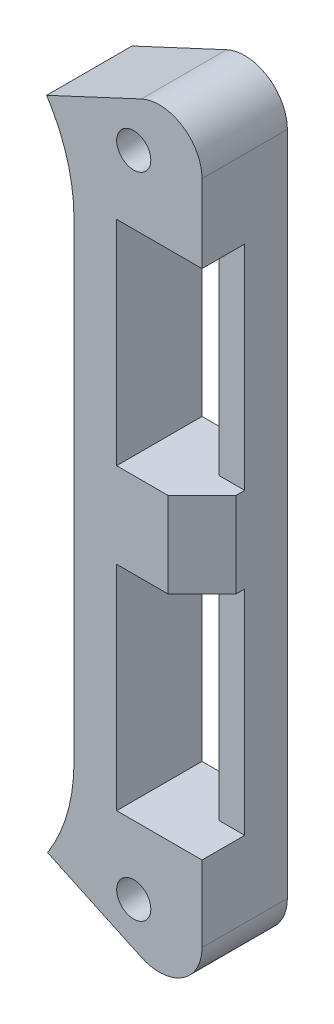
ISO-10303-21;
HEADER;
FILE_DESCRIPTION(('STEP AP214'),'2;1');
FILE_NAME('part.step','',(''),(''),'','','');
FILE_SCHEMA(('AUTOMOTIVE_DESIGN { 1 0 10303 214 1 1 1 1 }'));
ENDSEC;
DATA;
#1=APPLICATION_CONTEXT('core data for automotive mechanical design processes');
#2=APPLICATION_PROTOCOL_DEFINITION('international standard','automotive_design',2000,#1);
#3=PRODUCT_CONTEXT('',#1,'mechanical');
#4=PRODUCT('Part','Part','',(#3));
#5=PRODUCT_RELATED_PRODUCT_CATEGORY('part','',(#4));
#6=PRODUCT_DEFINITION_FORMATION('','',#4);
#7=PRODUCT_DEFINITION_CONTEXT('part definition',#1,'design');
#8=PRODUCT_DEFINITION('design','',#6,#7);
#9=PRODUCT_DEFINITION_SHAPE('','',#8);
#10=(LENGTH_UNIT() NAMED_UNIT(*) SI_UNIT(.MILLI.,.METRE.));
#11=(NAMED_UNIT(*) PLANE_ANGLE_UNIT() SI_UNIT($,.RADIAN.));
#12=(NAMED_UNIT(*) SI_UNIT($,.STERADIAN.) SOLID_ANGLE_UNIT());
#13=UNCERTAINTY_MEASURE_WITH_UNIT(LENGTH_MEASURE(1.E-05),#10,'distance_accuracy_value','');
#14=(GEOMETRIC_REPRESENTATION_CONTEXT(3) GLOBAL_UNCERTAINTY_ASSIGNED_CONTEXT((#13)) GLOBAL_UNIT_ASSIGNED_CONTEXT((#10,
#11,#12)) REPRESENTATION_CONTEXT('',''));
#15=CARTESIAN_POINT('',(0.,0.,0.));
#16=DIRECTION('',(0.,0.,1.));
#17=DIRECTION('',(1.,0.,0.));
#18=AXIS2_PLACEMENT_3D('',#15,#16,#17);
#19=CARTESIAN_POINT('',(-10.,76.7389258347136,-4.99999999999999));
#20=DIRECTION('',(0.,0.,-1.));
#21=DIRECTION('',(1.,0.,0.));
#22=AXIS2_PLACEMENT_3D('',#19,#20,#21);
#23=PLANE('',#22);
#24=DIRECTION('',(0.,-1.,0.));
#25=VECTOR('',#24,1.);
#26=CARTESIAN_POINT('',(0.,76.7389258347136,-4.99999999999999));
#27=LINE('',#26,#25);
#28=CARTESIAN_POINT('',(0.,76.7389258347136,-4.99999999999999));
#29=VERTEX_POINT('',#28);
#30=CARTESIAN_POINT('',(0.,51.7389258347136,-4.99999999999999));
#31=VERTEX_POINT('',#30);
#32=EDGE_CURVE('E230',#29,#31,#27,.T.);
#33=ORIENTED_EDGE('',*,*,#32,.F.);
#34=DIRECTION('',(1.,0.,0.));
#35=VECTOR('',#34,1.);
#36=CARTESIAN_POINT('',(-10.,76.7389258347136,-4.99999999999999));
#37=LINE('',#36,#35);
#38=CARTESIAN_POINT('',(-3.,76.7389258347136,-4.99999999999999));
#39=VERTEX_POINT('',#38);
#40=EDGE_CURVE('E238',#39,#29,#37,.T.);
#41=ORIENTED_EDGE('',*,*,#40,.F.);
#42=DIRECTION('',(0.,1.,0.));
#43=VECTOR('',#42,1.);
#44=CARTESIAN_POINT('',(-3.,76.7389258347136,-4.99999999999999));
#45=LINE('',#44,#43);
#46=CARTESIAN_POINT('',(-3.,51.7389258347136,-4.99999999999999));
#47=VERTEX_POINT('',#46);
#48=EDGE_CURVE('E316',#47,#39,#45,.T.);
#49=ORIENTED_EDGE('',*,*,#48,.F.);
#50=DIRECTION('',(-1.,0.,0.));
#51=VECTOR('',#50,1.);
#52=CARTESIAN_POINT('',(-10.,51.7389258347136,-4.99999999999999));
#53=LINE('',#52,#51);
#54=EDGE_CURVE('E362',#31,#47,#53,.T.);
#55=ORIENTED_EDGE('',*,*,#54,.F.);
#56=EDGE_LOOP('',(#33,#41,#49,#55));
#57=FACE_BOUND('',#56,.T.);
#58=ADVANCED_FACE('F35',(#57),#23,.F.);
#59=CARTESIAN_POINT('',(-10.,0.,0.));
#60=DIRECTION('',(-1.,0.,0.));
#61=DIRECTION('',(0.,0.,-1.));
#62=AXIS2_PLACEMENT_3D('',#59,#60,#61);
#63=PLANE('',#62);
#64=DIRECTION('',(0.,-1.,0.));
#65=VECTOR('',#64,1.);
#66=CARTESIAN_POINT('',(-10.,74.3641428895241,-10.));
#67=LINE('',#66,#65);
#68=CARTESIAN_POINT('',(-10.,76.7389258347136,-10.));
#69=VERTEX_POINT('',#68);
#70=CARTESIAN_POINT('',(-10.,51.7389258347136,-10.));
#71=VERTEX_POINT('',#70);
#72=EDGE_CURVE('E222',#69,#71,#67,.T.);
#73=ORIENTED_EDGE('',*,*,#72,.F.);
#74=DIRECTION('',(0.,0.,-1.));
#75=VECTOR('',#74,1.);
#76=CARTESIAN_POINT('',(-10.,76.7389258347136,0.));
#77=LINE('',#76,#75);
#78=CARTESIAN_POINT('',(-10.,76.7389258347136,0.));
#79=VERTEX_POINT('',#78);
#80=EDGE_CURVE('E213',#79,#69,#77,.T.);
#81=ORIENTED_EDGE('',*,*,#80,.F.);
#82=DIRECTION('',(0.,1.,0.));
#83=VECTOR('',#82,1.);
#84=CARTESIAN_POINT('',(-10.,76.7389258347136,0.));
#85=LINE('',#84,#83);
#86=CARTESIAN_POINT('',(-10.,51.7389258347136,0.));
#87=VERTEX_POINT('',#86);
#88=EDGE_CURVE('E214',#87,#79,#85,.T.);
#89=ORIENTED_EDGE('',*,*,#88,.F.);
#90=DIRECTION('',(0.,0.,1.));
#91=VECTOR('',#90,1.);
#92=CARTESIAN_POINT('',(-10.,51.7389258347136,0.));
#93=LINE('',#92,#91);
#94=EDGE_CURVE('E347',#71,#87,#93,.T.);
#95=ORIENTED_EDGE('',*,*,#94,.F.);
#96=EDGE_LOOP('',(#73,#81,#89,#95));
#97=FACE_BOUND('',#96,.T.);
#98=ADVANCED_FACE('F396',(#97),#63,.F.);
#99=CARTESIAN_POINT('',(-5.,76.7389258347136,-15.));
#100=DIRECTION('',(1.,0.,0.));
#101=DIRECTION('',(0.,0.,1.));
#102=AXIS2_PLACEMENT_3D('',#99,#100,#101);
#103=PLANE('',#102);
#104=DIRECTION('',(0.,-1.,0.));
#105=VECTOR('',#104,1.);
#106=CARTESIAN_POINT('',(-5.,76.7389258347136,-6.99999999999999));
#107=LINE('',#106,#105);
#108=CARTESIAN_POINT('',(-5.,76.7389258347136,-6.99999999999999));
#109=VERTEX_POINT('',#108);
#110=CARTESIAN_POINT('',(-5.,51.7389258347136,-6.99999999999999));
#111=VERTEX_POINT('',#110);
#112=EDGE_CURVE('E313',#109,#111,#107,.T.);
#113=ORIENTED_EDGE('',*,*,#112,.F.);
#114=DIRECTION('',(0.,0.,1.));
#115=VECTOR('',#114,1.);
#116=CARTESIAN_POINT('',(-5.,76.7389258347136,-15.));
#117=LINE('',#116,#115);
#118=CARTESIAN_POINT('',(-5.,76.7389258347136,-10.));
#119=VERTEX_POINT('',#118);
#120=EDGE_CURVE('E329',#119,#109,#117,.T.);
#121=ORIENTED_EDGE('',*,*,#120,.F.);
#122=DIRECTION('',(0.,1.,0.));
#123=VECTOR('',#122,1.);
#124=CARTESIAN_POINT('',(-5.,74.3641428895241,-10.));
#125=LINE('',#124,#123);
#126=CARTESIAN_POINT('',(-5.,51.7389258347136,-10.));
#127=VERTEX_POINT('',#126);
#128=EDGE_CURVE('E382',#127,#119,#125,.T.);
#129=ORIENTED_EDGE('',*,*,#128,.F.);
#130=DIRECTION('',(0.,0.,-1.));
#131=VECTOR('',#130,1.);
#132=CARTESIAN_POINT('',(-5.,51.7389258347136,-15.));
#133=LINE('',#132,#131);
#134=EDGE_CURVE('E198',#111,#127,#133,.T.);
#135=ORIENTED_EDGE('',*,*,#134,.F.);
#136=EDGE_LOOP('',(#113,#121,#129,#135));
#137=FACE_BOUND('',#136,.T.);
#138=ADVANCED_FACE('F466',(#137),#103,.F.);
#139=CARTESIAN_POINT('',(-5.,76.7389258347136,-6.99999999999999));
#140=DIRECTION('',(0.707106781186547,0.,-0.707106781186547));
#141=DIRECTION('',(0.,-1.,0.));
#142=AXIS2_PLACEMENT_3D('',#139,#140,#141);
#143=PLANE('',#142);
#144=DIRECTION('',(-0.707106781186548,0.,-0.707106781186548));
#145=VECTOR('',#144,1.);
#146=CARTESIAN_POINT('',(-5.,51.7389258347136,-6.99999999999999));
#147=LINE('',#146,#145);
#148=EDGE_CURVE('E337',#111,#47,#147,.F.);
#149=ORIENTED_EDGE('',*,*,#148,.T.);
#150=ORIENTED_EDGE('',*,*,#48,.T.);
#151=DIRECTION('',(0.707106781186548,0.,0.707106781186548));
#152=VECTOR('',#151,1.);
#153=CARTESIAN_POINT('',(-4.,76.7389258347136,-5.99999999999999));
#154=LINE('',#153,#152);
#155=EDGE_CURVE('E323',#39,#109,#154,.F.);
#156=ORIENTED_EDGE('',*,*,#155,.T.);
#157=ORIENTED_EDGE('',*,*,#112,.T.);
#158=EDGE_LOOP('',(#149,#150,#156,#157));
#159=FACE_BOUND('',#158,.T.);
#160=ADVANCED_FACE('F461',(#159),#143,.F.);
#161=CARTESIAN_POINT('',(-8.00000000000024,8.73892583471362,-10.));
#162=DIRECTION('',(0.,0.,1.));
#163=DIRECTION('',(-1.,0.,0.));
#164=AXIS2_PLACEMENT_3D('',#161,#162,#163);
#165=CYLINDRICAL_SURFACE('',#164,2.);
#166=CARTESIAN_POINT('',(-8.00000000000024,8.73892583471362,0.));
#167=DIRECTION('',(0.,0.,1.));
#168=DIRECTION('',(1.,0.,0.));
#169=AXIS2_PLACEMENT_3D('',#166,#167,#168);
#170=CIRCLE('',#169,2.);
#171=CARTESIAN_POINT('',(-6.00000000000024,8.73892583471362,0.));
#172=VERTEX_POINT('',#171);
#173=EDGE_CURVE('E245',#172,#172,#170,.T.);
#174=ORIENTED_EDGE('',*,*,#173,.T.);
#175=EDGE_LOOP('',(#174));
#176=FACE_BOUND('',#175,.T.);
#177=CARTESIAN_POINT('',(-8.00000000000024,8.73892583471362,-6.));
#178=DIRECTION('',(0.,0.,1.));
#179=DIRECTION('',(1.,0.,0.));
#180=AXIS2_PLACEMENT_3D('',#177,#178,#179);
#181=CIRCLE('',#180,2.);
#182=CARTESIAN_POINT('',(-6.00000000000024,8.73892583471362,-6.));
#183=VERTEX_POINT('',#182);
#184=EDGE_CURVE('E331',#183,#183,#181,.T.);
#185=ORIENTED_EDGE('',*,*,#184,.F.);
#186=EDGE_LOOP('',(#185));
#187=FACE_BOUND('',#186,.T.);
#188=ADVANCED_FACE('F474',(#176,#187),#165,.F.);
#189=CARTESIAN_POINT('',(-8.00000000000021,84.7389258347136,-10.));
#190=DIRECTION('',(0.,0.,1.));
#191=DIRECTION('',(-1.,0.,0.));
#192=AXIS2_PLACEMENT_3D('',#189,#190,#191);
#193=CYLINDRICAL_SURFACE('',#192,2.);
#194=CARTESIAN_POINT('',(-8.00000000000021,84.7389258347136,0.));
#195=DIRECTION('',(0.,0.,1.));
#196=DIRECTION('',(1.,0.,0.));
#197=AXIS2_PLACEMENT_3D('',#194,#195,#196);
#198=CIRCLE('',#197,2.);
#199=CARTESIAN_POINT('',(-6.00000000000021,84.7389258347136,0.));
#200=VERTEX_POINT('',#199);
#201=EDGE_CURVE('E235',#200,#200,#198,.T.);
#202=ORIENTED_EDGE('',*,*,#201,.T.);
#203=EDGE_LOOP('',(#202));
#204=FACE_BOUND('',#203,.T.);
#205=CARTESIAN_POINT('',(-8.00000000000021,84.7389258347136,-6.));
#206=DIRECTION('',(0.,0.,1.));
#207=DIRECTION('',(1.,0.,0.));
#208=AXIS2_PLACEMENT_3D('',#205,#206,#207);
#209=CIRCLE('',#208,2.);
#210=CARTESIAN_POINT('',(-6.00000000000021,84.7389258347136,-6.));
#211=VERTEX_POINT('',#210);
#212=EDGE_CURVE('E326',#211,#211,#209,.T.);
#213=ORIENTED_EDGE('',*,*,#212,.F.);
#214=EDGE_LOOP('',(#213));
#215=FACE_BOUND('',#214,.T.);
#216=ADVANCED_FACE('F673',(#204,#215),#193,.F.);
#217=CARTESIAN_POINT('',(-34.9999998912664,74.3641428895241,-10.));
#218=DIRECTION('',(0.,0.,-1.));
#219=DIRECTION('',(1.,0.,0.));
#220=AXIS2_PLACEMENT_3D('',#217,#218,#219);
#221=PLANE('',#220);
#222=ORIENTED_EDGE('',*,*,#128,.T.);
#223=DIRECTION('',(-1.,0.,0.));
#224=VECTOR('',#223,1.);
#225=CARTESIAN_POINT('',(-34.9999998912664,76.7389258347136,-10.));
#226=LINE('',#225,#224);
#227=EDGE_CURVE('E378',#119,#69,#226,.T.);
#228=ORIENTED_EDGE('',*,*,#227,.T.);
#229=ORIENTED_EDGE('',*,*,#72,.T.);
#230=DIRECTION('',(1.,0.,0.));
#231=VECTOR('',#230,1.);
#232=CARTESIAN_POINT('',(-14.,51.7389258347136,-10.));
#233=LINE('',#232,#231);
#234=EDGE_CURVE('E349',#71,#127,#233,.T.);
#235=ORIENTED_EDGE('',*,*,#234,.T.);
#236=EDGE_LOOP('',(#222,#228,#229,#235));
#237=FACE_BOUND('',#236,.T.);
#238=CARTESIAN_POINT('',(-10.,41.7389258347136,-10.));
#239=VERTEX_POINT('',#238);
#240=CARTESIAN_POINT('',(-10.,16.7389258347136,-10.));
#241=VERTEX_POINT('',#240);
#242=EDGE_CURVE('E195',#239,#241,#67,.T.);
#243=ORIENTED_EDGE('',*,*,#242,.T.);
#244=DIRECTION('',(1.,0.,0.));
#245=VECTOR('',#244,1.);
#246=CARTESIAN_POINT('',(-34.9999998912664,16.7389258347136,-10.));
#247=LINE('',#246,#245);
#248=CARTESIAN_POINT('',(-5.,16.7389258347136,-10.));
#249=VERTEX_POINT('',#248);
#250=EDGE_CURVE('E385',#241,#249,#247,.T.);
#251=ORIENTED_EDGE('',*,*,#250,.T.);
#252=CARTESIAN_POINT('',(-5.,41.7389258347136,-10.));
#253=VERTEX_POINT('',#252);
#254=EDGE_CURVE('E383',#249,#253,#125,.T.);
#255=ORIENTED_EDGE('',*,*,#254,.T.);
#256=DIRECTION('',(1.,0.,0.));
#257=VECTOR('',#256,1.);
#258=CARTESIAN_POINT('',(-14.,41.7389258347136,-10.));
#259=LINE('',#258,#257);
#260=EDGE_CURVE('E206',#239,#253,#259,.T.);
#261=ORIENTED_EDGE('',*,*,#260,.F.);
#262=EDGE_LOOP('',(#243,#251,#255,#261));
#263=FACE_BOUND('',#262,.T.);
#264=DIRECTION('',(0.,1.,0.));
#265=VECTOR('',#264,1.);
#266=CARTESIAN_POINT('',(0.,93.7107928727129,-10.));
#267=LINE('',#266,#265);
#268=CARTESIAN_POINT('',(0.,7.84842788558751,-10.));
#269=VERTEX_POINT('',#268);
#270=CARTESIAN_POINT('',(0.,85.8623649871254,-10.));
#271=VERTEX_POINT('',#270);
#272=EDGE_CURVE('E262',#269,#271,#267,.T.);
#273=ORIENTED_EDGE('',*,*,#272,.F.);
#274=CARTESIAN_POINT('',(-5.,7.84842788558748,-10.));
#275=DIRECTION('',(0.,0.,1.));
#276=DIRECTION('',(1.,0.,0.));
#277=AXIS2_PLACEMENT_3D('',#274,#275,#276);
#278=CIRCLE('',#277,5.);
#279=CARTESIAN_POINT('',(-7.11309130870352,3.31688895040425,-10.));
#280=VERTEX_POINT('',#279);
#281=EDGE_CURVE('E307',#280,#269,#278,.T.);
#282=ORIENTED_EDGE('',*,*,#281,.F.);
#283=DIRECTION('',(0.906307787036648,-0.422618261740704,0.));
#284=VECTOR('',#283,1.);
#285=CARTESIAN_POINT('',(0.,0.,-10.));
#286=LINE('',#285,#284);
#287=CARTESIAN_POINT('',(-18.0903807173959,8.43568306746135,-10.));
#288=VERTEX_POINT('',#287);
#289=EDGE_CURVE('E259',#288,#280,#286,.T.);
#290=ORIENTED_EDGE('',*,*,#289,.F.);
#291=CARTESIAN_POINT('',(-35.0000000000002,19.1157942896059,-10.));
#292=DIRECTION('',(0.,0.,-1.));
#293=DIRECTION('',(1.,0.,0.));
#294=AXIS2_PLACEMENT_3D('',#291,#292,#293);
#295=CIRCLE('',#294,20.);
#296=CARTESIAN_POINT('',(-15.0000000000002,19.1157942896059,-10.));
#297=VERTEX_POINT('',#296);
#298=EDGE_CURVE('E256',#297,#288,#295,.T.);
#299=ORIENTED_EDGE('',*,*,#298,.F.);
#300=DIRECTION('',(0.,-1.,0.));
#301=VECTOR('',#300,1.);
#302=CARTESIAN_POINT('',(-15.0000000000002,19.1157942896059,-10.));
#303=LINE('',#302,#301);
#304=CARTESIAN_POINT('',(-15.0000000000002,74.3620573798213,-10.));
#305=VERTEX_POINT('',#304);
#306=EDGE_CURVE('E252',#305,#297,#303,.T.);
#307=ORIENTED_EDGE('',*,*,#306,.F.);
#308=CARTESIAN_POINT('',(-34.9999998912664,74.3641428895241,-10.));
#309=DIRECTION('',(0.,0.,-1.));
#310=DIRECTION('',(1.,0.,0.));
#311=AXIS2_PLACEMENT_3D('',#308,#309,#310);
#312=CIRCLE('',#311,20.);
#313=CARTESIAN_POINT('',(-18.2040333666436,85.2221127045378,-10.));
#314=VERTEX_POINT('',#313);
#315=EDGE_CURVE('E249',#314,#305,#312,.T.);
#316=ORIENTED_EDGE('',*,*,#315,.F.);
#317=DIRECTION('',(-0.906307787036648,-0.422618261740704,0.));
#318=VECTOR('',#317,1.);
#319=CARTESIAN_POINT('',(-18.2040333666436,85.2221127045378,-10.));
#320=LINE('',#319,#318);
#321=CARTESIAN_POINT('',(-7.11309130870352,90.3939039223087,-10.));
#322=VERTEX_POINT('',#321);
#323=EDGE_CURVE('E265',#322,#314,#320,.T.);
#324=ORIENTED_EDGE('',*,*,#323,.F.);
#325=CARTESIAN_POINT('',(-5.,85.8623649871254,-10.));
#326=DIRECTION('',(0.,0.,1.));
#327=DIRECTION('',(1.,0.,0.));
#328=AXIS2_PLACEMENT_3D('',#325,#326,#327);
#329=CIRCLE('',#328,5.);
#330=EDGE_CURVE('E304',#271,#322,#329,.T.);
#331=ORIENTED_EDGE('',*,*,#330,.F.);
#332=EDGE_LOOP('',(#273,#282,#290,#299,#307,#316,#324,#331));
#333=FACE_BOUND('',#332,.T.);
#334=CARTESIAN_POINT('',(-8.00000000000024,8.73892583471362,-10.));
#335=DIRECTION('',(0.,0.,1.));
#336=DIRECTION('',(1.,0.,0.));
#337=AXIS2_PLACEMENT_3D('',#334,#335,#336);
#338=CIRCLE('',#337,3.25);
#339=CARTESIAN_POINT('',(-4.75000000000024,8.73892583471362,-10.));
#340=VERTEX_POINT('',#339);
#341=EDGE_CURVE('E366',#340,#340,#338,.T.);
#342=ORIENTED_EDGE('',*,*,#341,.T.);
#343=EDGE_LOOP('',(#342));
#344=FACE_BOUND('',#343,.T.);
#345=CARTESIAN_POINT('',(-8.00000000000021,84.7389258347136,-10.));
#346=DIRECTION('',(0.,0.,1.));
#347=DIRECTION('',(1.,0.,0.));
#348=AXIS2_PLACEMENT_3D('',#345,#346,#347);
#349=CIRCLE('',#348,3.25);
#350=CARTESIAN_POINT('',(-4.75000000000021,84.7389258347136,-10.));
#351=VERTEX_POINT('',#350);
#352=EDGE_CURVE('E334',#351,#351,#349,.T.);
#353=ORIENTED_EDGE('',*,*,#352,.T.);
#354=EDGE_LOOP('',(#353));
#355=FACE_BOUND('',#354,.T.);
#356=ADVANCED_FACE('F393',(#237,#263,#333,#344,#355),#221,.T.);
#357=CARTESIAN_POINT('',(-34.9999998912664,74.3641428895241,0.));
#358=DIRECTION('',(0.,0.,-1.));
#359=DIRECTION('',(1.,0.,0.));
#360=AXIS2_PLACEMENT_3D('',#357,#358,#359);
#361=PLANE('',#360);
#362=DIRECTION('',(1.,0.,0.));
#363=VECTOR('',#362,1.);
#364=CARTESIAN_POINT('',(-14.,51.7389258347136,0.));
#365=LINE('',#364,#363);
#366=CARTESIAN_POINT('',(-4.00000000000001,51.7389258347136,0.));
#367=VERTEX_POINT('',#366);
#368=EDGE_CURVE('E205',#87,#367,#365,.T.);
#369=ORIENTED_EDGE('',*,*,#368,.F.);
#370=ORIENTED_EDGE('',*,*,#88,.T.);
#371=DIRECTION('',(1.,0.,0.));
#372=VECTOR('',#371,1.);
#373=CARTESIAN_POINT('',(-10.,76.7389258347136,0.));
#374=LINE('',#373,#372);
#375=CARTESIAN_POINT('',(0.,76.7389258347136,0.));
#376=VERTEX_POINT('',#375);
#377=EDGE_CURVE('E226',#79,#376,#374,.T.);
#378=ORIENTED_EDGE('',*,*,#377,.T.);
#379=DIRECTION('',(0.,1.,0.));
#380=VECTOR('',#379,1.);
#381=CARTESIAN_POINT('',(0.,93.7107928727129,0.));
#382=LINE('',#381,#380);
#383=CARTESIAN_POINT('',(0.,85.8623649871254,0.));
#384=VERTEX_POINT('',#383);
#385=EDGE_CURVE('E280',#376,#384,#382,.T.);
#386=ORIENTED_EDGE('',*,*,#385,.T.);
#387=CARTESIAN_POINT('',(-5.,85.8623649871254,0.));
#388=DIRECTION('',(0.,0.,1.));
#389=DIRECTION('',(1.,0.,0.));
#390=AXIS2_PLACEMENT_3D('',#387,#388,#389);
#391=CIRCLE('',#390,5.);
#392=CARTESIAN_POINT('',(-7.11309130870352,90.3939039223087,0.));
#393=VERTEX_POINT('',#392);
#394=EDGE_CURVE('E296',#393,#384,#391,.F.);
#395=ORIENTED_EDGE('',*,*,#394,.F.);
#396=DIRECTION('',(-0.906307787036648,-0.422618261740704,0.));
#397=VECTOR('',#396,1.);
#398=CARTESIAN_POINT('',(-18.2040333666436,85.2221127045378,0.));
#399=LINE('',#398,#397);
#400=CARTESIAN_POINT('',(-18.2040333666436,85.2221127045378,0.));
#401=VERTEX_POINT('',#400);
#402=EDGE_CURVE('E253',#393,#401,#399,.T.);
#403=ORIENTED_EDGE('',*,*,#402,.T.);
#404=CARTESIAN_POINT('',(-34.9999998912664,74.3641428895241,0.));
#405=DIRECTION('',(0.,0.,-1.));
#406=DIRECTION('',(1.,0.,0.));
#407=AXIS2_PLACEMENT_3D('',#404,#405,#406);
#408=CIRCLE('',#407,20.);
#409=CARTESIAN_POINT('',(-15.0000000000002,74.3620573798213,0.));
#410=VERTEX_POINT('',#409);
#411=EDGE_CURVE('E248',#401,#410,#408,.T.);
#412=ORIENTED_EDGE('',*,*,#411,.T.);
#413=DIRECTION('',(0.,-1.,0.));
#414=VECTOR('',#413,1.);
#415=CARTESIAN_POINT('',(-15.0000000000002,19.1157942896059,0.));
#416=LINE('',#415,#414);
#417=CARTESIAN_POINT('',(-15.0000000000002,19.1157942896059,0.));
#418=VERTEX_POINT('',#417);
#419=EDGE_CURVE('E271',#410,#418,#416,.T.);
#420=ORIENTED_EDGE('',*,*,#419,.T.);
#421=CARTESIAN_POINT('',(-35.0000000000002,19.1157942896059,0.));
#422=DIRECTION('',(0.,0.,-1.));
#423=DIRECTION('',(1.,0.,0.));
#424=AXIS2_PLACEMENT_3D('',#421,#422,#423);
#425=CIRCLE('',#424,20.);
#426=CARTESIAN_POINT('',(-18.0903807173959,8.43568306746135,0.));
#427=VERTEX_POINT('',#426);
#428=EDGE_CURVE('E274',#418,#427,#425,.T.);
#429=ORIENTED_EDGE('',*,*,#428,.T.);
#430=DIRECTION('',(0.906307787036648,-0.422618261740704,0.));
#431=VECTOR('',#430,1.);
#432=CARTESIAN_POINT('',(0.,0.,0.));
#433=LINE('',#432,#431);
#434=CARTESIAN_POINT('',(-7.11309130870352,3.31688895040425,0.));
#435=VERTEX_POINT('',#434);
#436=EDGE_CURVE('E277',#427,#435,#433,.T.);
#437=ORIENTED_EDGE('',*,*,#436,.T.);
#438=CARTESIAN_POINT('',(-5.,7.84842788558748,0.));
#439=DIRECTION('',(0.,0.,1.));
#440=DIRECTION('',(1.,0.,0.));
#441=AXIS2_PLACEMENT_3D('',#438,#439,#440);
#442=CIRCLE('',#441,5.);
#443=CARTESIAN_POINT('',(0.,7.84842788558751,0.));
#444=VERTEX_POINT('',#443);
#445=EDGE_CURVE('E299',#444,#435,#442,.F.);
#446=ORIENTED_EDGE('',*,*,#445,.F.);
#447=CARTESIAN_POINT('',(0.,16.7389258347136,0.));
#448=VERTEX_POINT('',#447);
#449=EDGE_CURVE('E281',#444,#448,#382,.T.);
#450=ORIENTED_EDGE('',*,*,#449,.T.);
#451=DIRECTION('',(1.,0.,0.));
#452=VECTOR('',#451,1.);
#453=CARTESIAN_POINT('',(-10.,16.7389258347136,0.));
#454=LINE('',#453,#452);
#455=CARTESIAN_POINT('',(-10.,16.7389258347136,0.));
#456=VERTEX_POINT('',#455);
#457=EDGE_CURVE('E212',#456,#448,#454,.T.);
#458=ORIENTED_EDGE('',*,*,#457,.F.);
#459=CARTESIAN_POINT('',(-10.,41.7389258347136,0.));
#460=VERTEX_POINT('',#459);
#461=EDGE_CURVE('E192',#456,#460,#85,.T.);
#462=ORIENTED_EDGE('',*,*,#461,.T.);
#463=DIRECTION('',(1.,0.,0.));
#464=VECTOR('',#463,1.);
#465=CARTESIAN_POINT('',(-14.,41.7389258347136,0.));
#466=LINE('',#465,#464);
#467=CARTESIAN_POINT('',(-4.00000000000001,41.7389258347136,0.));
#468=VERTEX_POINT('',#467);
#469=EDGE_CURVE('E202',#460,#468,#466,.T.);
#470=ORIENTED_EDGE('',*,*,#469,.T.);
#471=DIRECTION('',(0.,-1.,0.));
#472=VECTOR('',#471,1.);
#473=CARTESIAN_POINT('',(-4.,74.3641428895241,0.));
#474=LINE('',#473,#472);
#475=EDGE_CURVE('E43',#367,#468,#474,.T.);
#476=ORIENTED_EDGE('',*,*,#475,.F.);
#477=EDGE_LOOP('',(#369,#370,#378,#386,#395,#403,#412,#420,#429,#437,#446,#450,#458,#462,#470,#476));
#478=FACE_BOUND('',#477,.T.);
#479=ORIENTED_EDGE('',*,*,#173,.F.);
#480=EDGE_LOOP('',(#479));
#481=FACE_BOUND('',#480,.T.);
#482=ORIENTED_EDGE('',*,*,#201,.F.);
#483=EDGE_LOOP('',(#482));
#484=FACE_BOUND('',#483,.T.);
#485=ADVANCED_FACE('F208',(#478,#481,#484),#361,.F.);
#486=CARTESIAN_POINT('',(-34.9999998912664,74.3641428895241,-10.));
#487=DIRECTION('',(0.,0.,1.));
#488=DIRECTION('',(-1.,0.,0.));
#489=AXIS2_PLACEMENT_3D('',#486,#487,#488);
#490=CYLINDRICAL_SURFACE('',#489,20.);
#491=ORIENTED_EDGE('',*,*,#411,.F.);
#492=DIRECTION('',(0.,0.,1.));
#493=VECTOR('',#492,1.);
#494=CARTESIAN_POINT('',(-18.2040333666436,85.2221127045378,-10.));
#495=LINE('',#494,#493);
#496=EDGE_CURVE('E268',#314,#401,#495,.T.);
#497=ORIENTED_EDGE('',*,*,#496,.F.);
#498=ORIENTED_EDGE('',*,*,#315,.T.);
#499=DIRECTION('',(0.,0.,1.));
#500=VECTOR('',#499,1.);
#501=CARTESIAN_POINT('',(-15.0000000000002,74.3620573798213,-10.));
#502=LINE('',#501,#500);
#503=EDGE_CURVE('E290',#305,#410,#502,.T.);
#504=ORIENTED_EDGE('',*,*,#503,.T.);
#505=EDGE_LOOP('',(#491,#497,#498,#504));
#506=FACE_BOUND('',#505,.T.);
#507=ADVANCED_FACE('F418',(#506),#490,.F.);
#508=CARTESIAN_POINT('',(-15.0000000000002,19.1157942896059,-10.));
#509=DIRECTION('',(1.,0.,0.));
#510=DIRECTION('',(0.,0.,1.));
#511=AXIS2_PLACEMENT_3D('',#508,#509,#510);
#512=PLANE('',#511);
#513=ORIENTED_EDGE('',*,*,#419,.F.);
#514=ORIENTED_EDGE('',*,*,#503,.F.);
#515=ORIENTED_EDGE('',*,*,#306,.T.);
#516=DIRECTION('',(0.,0.,1.));
#517=VECTOR('',#516,1.);
#518=CARTESIAN_POINT('',(-15.0000000000002,19.1157942896059,-10.));
#519=LINE('',#518,#517);
#520=EDGE_CURVE('E288',#297,#418,#519,.T.);
#521=ORIENTED_EDGE('',*,*,#520,.T.);
#522=EDGE_LOOP('',(#513,#514,#515,#521));
#523=FACE_BOUND('',#522,.T.);
#524=ADVANCED_FACE('F422',(#523),#512,.F.);
#525=CARTESIAN_POINT('',(-35.0000000000002,19.1157942896059,-10.));
#526=DIRECTION('',(0.,0.,1.));
#527=DIRECTION('',(-1.,0.,0.));
#528=AXIS2_PLACEMENT_3D('',#525,#526,#527);
#529=CYLINDRICAL_SURFACE('',#528,20.);
#530=ORIENTED_EDGE('',*,*,#428,.F.);
#531=ORIENTED_EDGE('',*,*,#520,.F.);
#532=ORIENTED_EDGE('',*,*,#298,.T.);
#533=DIRECTION('',(0.,0.,1.));
#534=VECTOR('',#533,1.);
#535=CARTESIAN_POINT('',(-18.0903807173959,8.43568306746135,-10.));
#536=LINE('',#535,#534);
#537=EDGE_CURVE('E286',#288,#427,#536,.T.);
#538=ORIENTED_EDGE('',*,*,#537,.T.);
#539=EDGE_LOOP('',(#530,#531,#532,#538));
#540=FACE_BOUND('',#539,.T.);
#541=ADVANCED_FACE('F427',(#540),#529,.F.);
#542=CARTESIAN_POINT('',(0.,0.,-10.));
#543=DIRECTION('',(0.422618261740704,0.906307787036648,0.));
#544=DIRECTION('',(-0.906307787036648,0.422618261740704,0.));
#545=AXIS2_PLACEMENT_3D('',#542,#543,#544);
#546=PLANE('',#545);
#547=ORIENTED_EDGE('',*,*,#436,.F.);
#548=ORIENTED_EDGE('',*,*,#537,.F.);
#549=ORIENTED_EDGE('',*,*,#289,.T.);
#550=DIRECTION('',(0.,0.,1.));
#551=VECTOR('',#550,1.);
#552=CARTESIAN_POINT('',(-7.11309130870352,3.31688895040425,-10.));
#553=LINE('',#552,#551);
#554=EDGE_CURVE('E302',#435,#280,#553,.F.);
#555=ORIENTED_EDGE('',*,*,#554,.F.);
#556=EDGE_LOOP('',(#547,#548,#549,#555));
#557=FACE_BOUND('',#556,.T.);
#558=ADVANCED_FACE('F431',(#557),#546,.F.);
#559=CARTESIAN_POINT('',(0.,93.7107928727129,-10.));
#560=DIRECTION('',(-1.,0.,0.));
#561=DIRECTION('',(0.,0.,-1.));
#562=AXIS2_PLACEMENT_3D('',#559,#560,#561);
#563=PLANE('',#562);
#564=DIRECTION('',(0.,0.,1.));
#565=VECTOR('',#564,1.);
#566=CARTESIAN_POINT('',(0.,41.7389258347136,-10.));
#567=LINE('',#566,#565);
#568=CARTESIAN_POINT('',(0.,41.7389258347136,-4.99999999999999));
#569=VERTEX_POINT('',#568);
#570=CARTESIAN_POINT('',(0.,41.7389258347136,-3.99999999999999));
#571=VERTEX_POINT('',#570);
#572=EDGE_CURVE('E453',#569,#571,#567,.T.);
#573=ORIENTED_EDGE('',*,*,#572,.F.);
#574=CARTESIAN_POINT('',(0.,16.7389258347136,-4.99999999999999));
#575=VERTEX_POINT('',#574);
#576=EDGE_CURVE('E229',#569,#575,#27,.T.);
#577=ORIENTED_EDGE('',*,*,#576,.T.);
#578=DIRECTION('',(0.,0.,1.));
#579=VECTOR('',#578,1.);
#580=CARTESIAN_POINT('',(0.,16.7389258347136,0.));
#581=LINE('',#580,#579);
#582=EDGE_CURVE('E220',#575,#448,#581,.T.);
#583=ORIENTED_EDGE('',*,*,#582,.T.);
#584=ORIENTED_EDGE('',*,*,#449,.F.);
#585=DIRECTION('',(0.,0.,1.));
#586=VECTOR('',#585,1.);
#587=CARTESIAN_POINT('',(0.,7.84842788558748,-10.));
#588=LINE('',#587,#586);
#589=EDGE_CURVE('E294',#269,#444,#588,.T.);
#590=ORIENTED_EDGE('',*,*,#589,.F.);
#591=ORIENTED_EDGE('',*,*,#272,.T.);
#592=DIRECTION('',(0.,0.,1.));
#593=VECTOR('',#592,1.);
#594=CARTESIAN_POINT('',(0.,85.8623649871254,-10.));
#595=LINE('',#594,#593);
#596=EDGE_CURVE('E292',#384,#271,#595,.F.);
#597=ORIENTED_EDGE('',*,*,#596,.F.);
#598=ORIENTED_EDGE('',*,*,#385,.F.);
#599=DIRECTION('',(0.,0.,-1.));
#600=VECTOR('',#599,1.);
#601=CARTESIAN_POINT('',(0.,76.7389258347136,0.));
#602=LINE('',#601,#600);
#603=EDGE_CURVE('E227',#376,#29,#602,.T.);
#604=ORIENTED_EDGE('',*,*,#603,.T.);
#605=ORIENTED_EDGE('',*,*,#32,.T.);
#606=DIRECTION('',(0.,0.,-1.));
#607=VECTOR('',#606,1.);
#608=CARTESIAN_POINT('',(0.,51.7389258347136,-10.));
#609=LINE('',#608,#607);
#610=CARTESIAN_POINT('',(0.,51.7389258347136,-3.99999999999999));
#611=VERTEX_POINT('',#610);
#612=EDGE_CURVE('E356',#611,#31,#609,.T.);
#613=ORIENTED_EDGE('',*,*,#612,.F.);
#614=DIRECTION('',(0.,1.,0.));
#615=VECTOR('',#614,1.);
#616=CARTESIAN_POINT('',(0.,93.7107928727129,-3.99999999999999));
#617=LINE('',#616,#615);
#618=EDGE_CURVE('E339',#571,#611,#617,.T.);
#619=ORIENTED_EDGE('',*,*,#618,.F.);
#620=EDGE_LOOP('',(#573,#577,#583,#584,#590,#591,#597,#598,#604,#605,#613,#619));
#621=FACE_BOUND('',#620,.T.);
#622=ADVANCED_FACE('F406',(#621),#563,.F.);
#623=CARTESIAN_POINT('',(-18.2040333666436,85.2221127045378,-10.));
#624=DIRECTION('',(0.422618261740704,-0.906307787036648,0.));
#625=DIRECTION('',(0.906307787036648,0.422618261740704,0.));
#626=AXIS2_PLACEMENT_3D('',#623,#624,#625);
#627=PLANE('',#626);
#628=ORIENTED_EDGE('',*,*,#323,.T.);
#629=ORIENTED_EDGE('',*,*,#496,.T.);
#630=ORIENTED_EDGE('',*,*,#402,.F.);
#631=DIRECTION('',(0.,0.,1.));
#632=VECTOR('',#631,1.);
#633=CARTESIAN_POINT('',(-7.11309130870352,90.3939039223087,-10.));
#634=LINE('',#633,#632);
#635=EDGE_CURVE('E310',#322,#393,#634,.T.);
#636=ORIENTED_EDGE('',*,*,#635,.F.);
#637=EDGE_LOOP('',(#628,#629,#630,#636));
#638=FACE_BOUND('',#637,.T.);
#639=ADVANCED_FACE('F414',(#638),#627,.F.);
#640=CARTESIAN_POINT('',(-5.,7.84842788558748,-10.));
#641=DIRECTION('',(0.,0.,1.));
#642=DIRECTION('',(-1.,0.,0.));
#643=AXIS2_PLACEMENT_3D('',#640,#641,#642);
#644=CYLINDRICAL_SURFACE('',#643,5.);
#645=ORIENTED_EDGE('',*,*,#281,.T.);
#646=ORIENTED_EDGE('',*,*,#589,.T.);
#647=ORIENTED_EDGE('',*,*,#445,.T.);
#648=ORIENTED_EDGE('',*,*,#554,.T.);
#649=EDGE_LOOP('',(#645,#646,#647,#648));
#650=FACE_BOUND('',#649,.T.);
#651=ADVANCED_FACE('F434',(#650),#644,.T.);
#652=CARTESIAN_POINT('',(-5.,85.8623649871254,-10.));
#653=DIRECTION('',(0.,0.,1.));
#654=DIRECTION('',(-1.,0.,0.));
#655=AXIS2_PLACEMENT_3D('',#652,#653,#654);
#656=CYLINDRICAL_SURFACE('',#655,5.);
#657=ORIENTED_EDGE('',*,*,#330,.T.);
#658=ORIENTED_EDGE('',*,*,#635,.T.);
#659=ORIENTED_EDGE('',*,*,#394,.T.);
#660=ORIENTED_EDGE('',*,*,#596,.T.);
#661=EDGE_LOOP('',(#657,#658,#659,#660));
#662=FACE_BOUND('',#661,.T.);
#663=ADVANCED_FACE('F410',(#662),#656,.T.);
#664=CARTESIAN_POINT('',(-10.,16.7389258347136,0.));
#665=DIRECTION('',(0.,-1.,0.));
#666=DIRECTION('',(0.,0.,1.));
#667=AXIS2_PLACEMENT_3D('',#664,#665,#666);
#668=PLANE('',#667);
#669=ORIENTED_EDGE('',*,*,#582,.F.);
#670=DIRECTION('',(1.,0.,0.));
#671=VECTOR('',#670,1.);
#672=CARTESIAN_POINT('',(-10.,16.7389258347136,-4.99999999999999));
#673=LINE('',#672,#671);
#674=CARTESIAN_POINT('',(-3.,16.7389258347136,-4.99999999999999));
#675=VERTEX_POINT('',#674);
#676=EDGE_CURVE('E236',#675,#575,#673,.T.);
#677=ORIENTED_EDGE('',*,*,#676,.F.);
#678=DIRECTION('',(-0.707106781186548,0.,-0.707106781186548));
#679=VECTOR('',#678,1.);
#680=CARTESIAN_POINT('',(-4.,16.7389258347136,-5.99999999999999));
#681=LINE('',#680,#679);
#682=CARTESIAN_POINT('',(-5.,16.7389258347136,-6.99999999999999));
#683=VERTEX_POINT('',#682);
#684=EDGE_CURVE('E320',#683,#675,#681,.F.);
#685=ORIENTED_EDGE('',*,*,#684,.F.);
#686=DIRECTION('',(0.,0.,1.));
#687=VECTOR('',#686,1.);
#688=CARTESIAN_POINT('',(-5.,16.7389258347136,-15.));
#689=LINE('',#688,#687);
#690=EDGE_CURVE('E375',#249,#683,#689,.T.);
#691=ORIENTED_EDGE('',*,*,#690,.F.);
#692=ORIENTED_EDGE('',*,*,#250,.F.);
#693=DIRECTION('',(0.,0.,1.));
#694=VECTOR('',#693,1.);
#695=CARTESIAN_POINT('',(-10.,16.7389258347136,0.));
#696=LINE('',#695,#694);
#697=EDGE_CURVE('E217',#241,#456,#696,.T.);
#698=ORIENTED_EDGE('',*,*,#697,.T.);
#699=ORIENTED_EDGE('',*,*,#457,.T.);
#700=EDGE_LOOP('',(#669,#677,#685,#691,#692,#698,#699));
#701=FACE_BOUND('',#700,.T.);
#702=ADVANCED_FACE('F441',(#701),#668,.F.);
#703=CARTESIAN_POINT('',(-3.,41.7389258347136,-4.99999999999999));
#704=VERTEX_POINT('',#703);
#705=EDGE_CURVE('E317',#675,#704,#45,.T.);
#706=ORIENTED_EDGE('',*,*,#705,.F.);
#707=ORIENTED_EDGE('',*,*,#676,.T.);
#708=ORIENTED_EDGE('',*,*,#576,.F.);
#709=DIRECTION('',(1.,0.,0.));
#710=VECTOR('',#709,1.);
#711=CARTESIAN_POINT('',(-10.,41.7389258347136,-4.99999999999999));
#712=LINE('',#711,#710);
#713=EDGE_CURVE('E199',#704,#569,#712,.T.);
#714=ORIENTED_EDGE('',*,*,#713,.F.);
#715=EDGE_LOOP('',(#706,#707,#708,#714));
#716=FACE_BOUND('',#715,.T.);
#717=ADVANCED_FACE('F452',(#716),#23,.F.);
#718=CARTESIAN_POINT('',(-10.,76.7389258347136,0.));
#719=DIRECTION('',(0.,1.,0.));
#720=DIRECTION('',(0.,0.,-1.));
#721=AXIS2_PLACEMENT_3D('',#718,#719,#720);
#722=PLANE('',#721);
#723=ORIENTED_EDGE('',*,*,#603,.F.);
#724=ORIENTED_EDGE('',*,*,#377,.F.);
#725=ORIENTED_EDGE('',*,*,#80,.T.);
#726=ORIENTED_EDGE('',*,*,#227,.F.);
#727=ORIENTED_EDGE('',*,*,#120,.T.);
#728=ORIENTED_EDGE('',*,*,#155,.F.);
#729=ORIENTED_EDGE('',*,*,#40,.T.);
#730=EDGE_LOOP('',(#723,#724,#725,#726,#727,#728,#729));
#731=FACE_BOUND('',#730,.T.);
#732=ADVANCED_FACE('F401',(#731),#722,.F.);
#733=ORIENTED_EDGE('',*,*,#461,.F.);
#734=ORIENTED_EDGE('',*,*,#697,.F.);
#735=ORIENTED_EDGE('',*,*,#242,.F.);
#736=DIRECTION('',(0.,0.,-1.));
#737=VECTOR('',#736,1.);
#738=CARTESIAN_POINT('',(-10.,41.7389258347136,0.));
#739=LINE('',#738,#737);
#740=EDGE_CURVE('E189',#460,#239,#739,.T.);
#741=ORIENTED_EDGE('',*,*,#740,.F.);
#742=EDGE_LOOP('',(#733,#734,#735,#741));
#743=FACE_BOUND('',#742,.T.);
#744=ADVANCED_FACE('F190',(#743),#63,.F.);
#745=ORIENTED_EDGE('',*,*,#254,.F.);
#746=ORIENTED_EDGE('',*,*,#690,.T.);
#747=CARTESIAN_POINT('',(-5.,41.7389258347136,-6.99999999999999));
#748=VERTEX_POINT('',#747);
#749=EDGE_CURVE('E312',#748,#683,#107,.T.);
#750=ORIENTED_EDGE('',*,*,#749,.F.);
#751=DIRECTION('',(0.,0.,1.));
#752=VECTOR('',#751,1.);
#753=CARTESIAN_POINT('',(-5.,41.7389258347136,-15.));
#754=LINE('',#753,#752);
#755=EDGE_CURVE('E351',#253,#748,#754,.T.);
#756=ORIENTED_EDGE('',*,*,#755,.F.);
#757=EDGE_LOOP('',(#745,#746,#750,#756));
#758=FACE_BOUND('',#757,.T.);
#759=ADVANCED_FACE('F446',(#758),#103,.F.);
#760=DIRECTION('',(0.707106781186548,0.,0.707106781186548));
#761=VECTOR('',#760,1.);
#762=CARTESIAN_POINT('',(-5.,41.7389258347136,-6.99999999999999));
#763=LINE('',#762,#761);
#764=EDGE_CURVE('E325',#704,#748,#763,.F.);
#765=ORIENTED_EDGE('',*,*,#764,.T.);
#766=ORIENTED_EDGE('',*,*,#749,.T.);
#767=ORIENTED_EDGE('',*,*,#684,.T.);
#768=ORIENTED_EDGE('',*,*,#705,.T.);
#769=EDGE_LOOP('',(#765,#766,#767,#768));
#770=FACE_BOUND('',#769,.T.);
#771=ADVANCED_FACE('F450',(#770),#143,.F.);
#772=CARTESIAN_POINT('',(-8.00000000000021,84.7389258347136,-6.));
#773=DIRECTION('',(0.,0.,-1.));
#774=DIRECTION('',(1.,0.,0.));
#775=AXIS2_PLACEMENT_3D('',#772,#773,#774);
#776=CYLINDRICAL_SURFACE('',#775,3.25);
#777=CARTESIAN_POINT('',(-8.00000000000021,84.7389258347136,-6.));
#778=DIRECTION('',(0.,0.,1.));
#779=DIRECTION('',(1.,0.,0.));
#780=AXIS2_PLACEMENT_3D('',#777,#778,#779);
#781=CIRCLE('',#780,3.25);
#782=CARTESIAN_POINT('',(-4.75000000000021,84.7389258347136,-6.));
#783=VERTEX_POINT('',#782);
#784=EDGE_CURVE('E330',#783,#783,#781,.T.);
#785=ORIENTED_EDGE('',*,*,#784,.T.);
#786=EDGE_LOOP('',(#785));
#787=FACE_BOUND('',#786,.T.);
#788=ORIENTED_EDGE('',*,*,#352,.F.);
#789=EDGE_LOOP('',(#788));
#790=FACE_BOUND('',#789,.T.);
#791=ADVANCED_FACE('F508',(#787,#790),#776,.F.);
#792=CARTESIAN_POINT('',(-8.00000000000021,84.7389258347136,-6.));
#793=DIRECTION('',(0.,0.,-1.));
#794=DIRECTION('',(1.,0.,0.));
#795=AXIS2_PLACEMENT_3D('',#792,#793,#794);
#796=PLANE('',#795);
#797=ORIENTED_EDGE('',*,*,#212,.T.);
#798=EDGE_LOOP('',(#797));
#799=FACE_BOUND('',#798,.T.);
#800=ORIENTED_EDGE('',*,*,#784,.F.);
#801=EDGE_LOOP('',(#800));
#802=FACE_BOUND('',#801,.T.);
#803=ADVANCED_FACE('F514',(#799,#802),#796,.T.);
#804=CARTESIAN_POINT('',(-8.00000000000024,8.73892583471362,-6.));
#805=DIRECTION('',(0.,0.,-1.));
#806=DIRECTION('',(1.,0.,0.));
#807=AXIS2_PLACEMENT_3D('',#804,#805,#806);
#808=CYLINDRICAL_SURFACE('',#807,3.25);
#809=CARTESIAN_POINT('',(-8.00000000000024,8.73892583471362,-6.));
#810=DIRECTION('',(0.,0.,1.));
#811=DIRECTION('',(1.,0.,0.));
#812=AXIS2_PLACEMENT_3D('',#809,#810,#811);
#813=CIRCLE('',#812,3.25);
#814=CARTESIAN_POINT('',(-4.75000000000024,8.73892583471362,-6.));
#815=VERTEX_POINT('',#814);
#816=EDGE_CURVE('E335',#815,#815,#813,.T.);
#817=ORIENTED_EDGE('',*,*,#816,.T.);
#818=EDGE_LOOP('',(#817));
#819=FACE_BOUND('',#818,.T.);
#820=ORIENTED_EDGE('',*,*,#341,.F.);
#821=EDGE_LOOP('',(#820));
#822=FACE_BOUND('',#821,.T.);
#823=ADVANCED_FACE('F521',(#819,#822),#808,.F.);
#824=CARTESIAN_POINT('',(-8.00000000000024,8.73892583471362,-6.));
#825=DIRECTION('',(0.,0.,-1.));
#826=DIRECTION('',(1.,0.,0.));
#827=AXIS2_PLACEMENT_3D('',#824,#825,#826);
#828=PLANE('',#827);
#829=ORIENTED_EDGE('',*,*,#184,.T.);
#830=EDGE_LOOP('',(#829));
#831=FACE_BOUND('',#830,.T.);
#832=ORIENTED_EDGE('',*,*,#816,.F.);
#833=EDGE_LOOP('',(#832));
#834=FACE_BOUND('',#833,.T.);
#835=ADVANCED_FACE('F529',(#831,#834),#828,.T.);
#836=CARTESIAN_POINT('',(-14.,51.7389258347136,-10.));
#837=DIRECTION('',(0.,1.,0.));
#838=DIRECTION('',(0.,0.,-1.));
#839=AXIS2_PLACEMENT_3D('',#836,#837,#838);
#840=PLANE('',#839);
#841=ORIENTED_EDGE('',*,*,#612,.T.);
#842=ORIENTED_EDGE('',*,*,#54,.T.);
#843=ORIENTED_EDGE('',*,*,#148,.F.);
#844=ORIENTED_EDGE('',*,*,#134,.T.);
#845=ORIENTED_EDGE('',*,*,#234,.F.);
#846=ORIENTED_EDGE('',*,*,#94,.T.);
#847=ORIENTED_EDGE('',*,*,#368,.T.);
#848=DIRECTION('',(0.707106781186549,0.,-0.707106781186546));
#849=VECTOR('',#848,1.);
#850=CARTESIAN_POINT('',(-4.00000000000002,51.7389258347136,0.));
#851=LINE('',#850,#849);
#852=EDGE_CURVE('E55',#611,#367,#851,.F.);
#853=ORIENTED_EDGE('',*,*,#852,.F.);
#854=EDGE_LOOP('',(#841,#842,#843,#844,#845,#846,#847,#853));
#855=FACE_BOUND('',#854,.T.);
#856=ADVANCED_FACE('F345',(#855),#840,.T.);
#857=CARTESIAN_POINT('',(-14.,41.7389258347136,-10.));
#858=DIRECTION('',(0.,-1.,0.));
#859=DIRECTION('',(0.,0.,1.));
#860=AXIS2_PLACEMENT_3D('',#857,#858,#859);
#861=PLANE('',#860);
#862=ORIENTED_EDGE('',*,*,#469,.F.);
#863=ORIENTED_EDGE('',*,*,#740,.T.);
#864=ORIENTED_EDGE('',*,*,#260,.T.);
#865=ORIENTED_EDGE('',*,*,#755,.T.);
#866=ORIENTED_EDGE('',*,*,#764,.F.);
#867=ORIENTED_EDGE('',*,*,#713,.T.);
#868=ORIENTED_EDGE('',*,*,#572,.T.);
#869=DIRECTION('',(-0.707106781186549,0.,0.707106781186546));
#870=VECTOR('',#869,1.);
#871=CARTESIAN_POINT('',(-4.00000000000002,41.7389258347136,0.));
#872=LINE('',#871,#870);
#873=EDGE_CURVE('E11',#468,#571,#872,.F.);
#874=ORIENTED_EDGE('',*,*,#873,.F.);
#875=EDGE_LOOP('',(#862,#863,#864,#865,#866,#867,#868,#874));
#876=FACE_BOUND('',#875,.T.);
#877=ADVANCED_FACE('F203',(#876),#861,.T.);
#878=CARTESIAN_POINT('',(0.,93.7107928727129,-3.99999999999999));
#879=DIRECTION('',(-0.707106781186546,0.,-0.707106781186549));
#880=DIRECTION('',(0.,1.,0.));
#881=AXIS2_PLACEMENT_3D('',#878,#879,#880);
#882=PLANE('',#881);
#883=ORIENTED_EDGE('',*,*,#873,.T.);
#884=ORIENTED_EDGE('',*,*,#618,.T.);
#885=ORIENTED_EDGE('',*,*,#852,.T.);
#886=ORIENTED_EDGE('',*,*,#475,.T.);
#887=EDGE_LOOP('',(#883,#884,#885,#886));
#888=FACE_BOUND('',#887,.T.);
#889=ADVANCED_FACE('F37',(#888),#882,.F.);
#890=CLOSED_SHELL('',(#58,#98,#138,#160,#188,#216,#356,#485,#507,#524,#541,#558,#622,#639,#651,
#663,#702,#717,#732,#744,#759,#771,#791,#803,#823,#835,#856,#877,#889));
#891=MANIFOLD_SOLID_BREP('B2',#890);
#892=ADVANCED_BREP_SHAPE_REPRESENTATION('',(#18,#891),#14);
#893=SHAPE_DEFINITION_REPRESENTATION(#9,#892);
ENDSEC;
END-ISO-10303-21;
